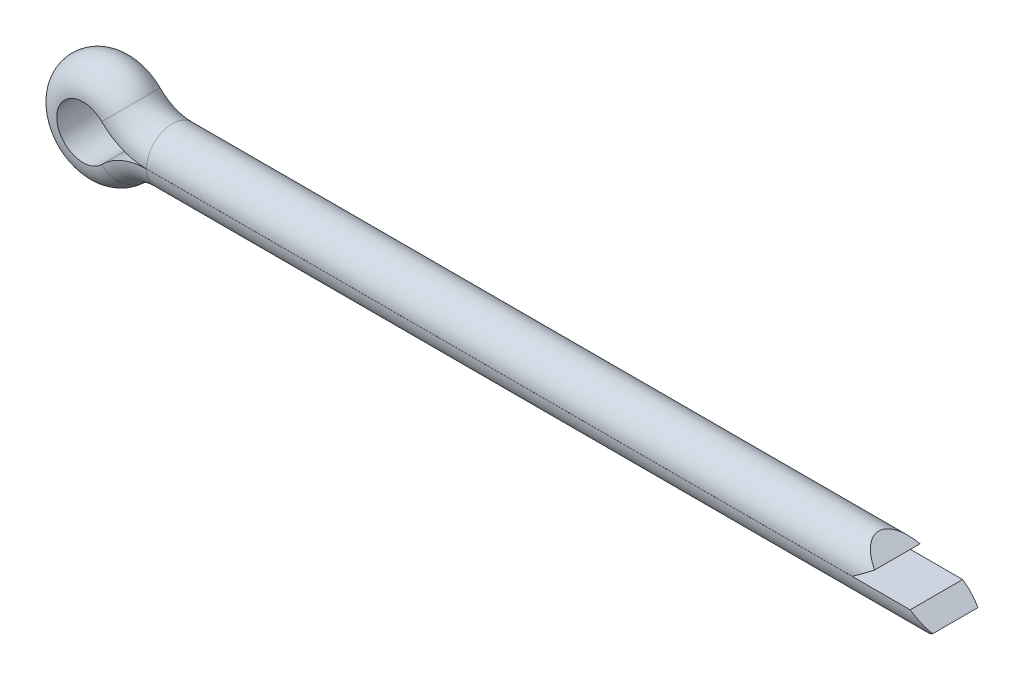
ISO-10303-21;
HEADER;
FILE_DESCRIPTION(('STEP AP214'),'2;1');
FILE_NAME('part.step','',(''),(''),'','','');
FILE_SCHEMA(('AUTOMOTIVE_DESIGN { 1 0 10303 214 1 1 1 1 }'));
ENDSEC;
DATA;
#1=APPLICATION_CONTEXT('core data for automotive mechanical design processes');
#2=APPLICATION_PROTOCOL_DEFINITION('international standard','automotive_design',2000,#1);
#3=PRODUCT_CONTEXT('',#1,'mechanical');
#4=PRODUCT('Part','Part','',(#3));
#5=PRODUCT_RELATED_PRODUCT_CATEGORY('part','',(#4));
#6=PRODUCT_DEFINITION_FORMATION('','',#4);
#7=PRODUCT_DEFINITION_CONTEXT('part definition',#1,'design');
#8=PRODUCT_DEFINITION('design','',#6,#7);
#9=PRODUCT_DEFINITION_SHAPE('','',#8);
#10=(LENGTH_UNIT() NAMED_UNIT(*) SI_UNIT(.MILLI.,.METRE.));
#11=(NAMED_UNIT(*) PLANE_ANGLE_UNIT() SI_UNIT($,.RADIAN.));
#12=(NAMED_UNIT(*) SI_UNIT($,.STERADIAN.) SOLID_ANGLE_UNIT());
#13=UNCERTAINTY_MEASURE_WITH_UNIT(LENGTH_MEASURE(1.E-05),#10,'distance_accuracy_value','');
#14=(GEOMETRIC_REPRESENTATION_CONTEXT(3) GLOBAL_UNCERTAINTY_ASSIGNED_CONTEXT((#13)) GLOBAL_UNIT_ASSIGNED_CONTEXT((#10,
#11,#12)) REPRESENTATION_CONTEXT('',''));
#15=CARTESIAN_POINT('',(0.,0.,0.));
#16=DIRECTION('',(0.,0.,1.));
#17=DIRECTION('',(1.,0.,0.));
#18=AXIS2_PLACEMENT_3D('',#15,#16,#17);
#19=CARTESIAN_POINT('',(0.,-0.00200000000000027,1.449998620689));
#20=DIRECTION('',(0.,-1.,0.));
#21=DIRECTION('',(0.,0.,-1.));
#22=AXIS2_PLACEMENT_3D('',#19,#20,#21);
#23=PLANE('',#22);
#24=DIRECTION('',(1.,0.,0.));
#25=VECTOR('',#24,1.);
#26=CARTESIAN_POINT('',(0.,-0.00200000000000027,1.449998620689));
#27=LINE('',#26,#25);
#28=CARTESIAN_POINT('',(0.,-0.00200000000000027,1.449998620689));
#29=VERTEX_POINT('',#28);
#30=CARTESIAN_POINT('',(42.1575308738926,-0.00199999999999788,1.449998620689));
#31=VERTEX_POINT('',#30);
#32=EDGE_CURVE('E40',#29,#31,#27,.T.);
#33=ORIENTED_EDGE('',*,*,#32,.T.);
#34=DIRECTION('',(0.,0.,-1.));
#35=VECTOR('',#34,1.);
#36=CARTESIAN_POINT('',(42.1575308738926,-0.00200000000000027,1.449998620689));
#37=LINE('',#36,#35);
#38=CARTESIAN_POINT('',(42.1575308738926,-0.00199999999999788,-1.449998620689));
#39=VERTEX_POINT('',#38);
#40=EDGE_CURVE('E96',#31,#39,#37,.T.);
#41=ORIENTED_EDGE('',*,*,#40,.T.);
#42=DIRECTION('',(1.,0.,0.));
#43=VECTOR('',#42,1.);
#44=CARTESIAN_POINT('',(0.,-0.00200000000000027,-1.449998620689));
#45=LINE('',#44,#43);
#46=CARTESIAN_POINT('',(0.,-0.00200000000000027,-1.449998620689));
#47=VERTEX_POINT('',#46);
#48=EDGE_CURVE('E11',#47,#39,#45,.T.);
#49=ORIENTED_EDGE('',*,*,#48,.F.);
#50=DIRECTION('',(0.,0.,-1.));
#51=VECTOR('',#50,1.);
#52=CARTESIAN_POINT('',(0.,-0.00200000000000027,1.449998620689));
#53=LINE('',#52,#51);
#54=EDGE_CURVE('E113',#29,#47,#53,.T.);
#55=ORIENTED_EDGE('',*,*,#54,.F.);
#56=EDGE_LOOP('',(#33,#41,#49,#55));
#57=FACE_BOUND('',#56,.T.);
#58=ADVANCED_FACE('F33',(#57),#23,.F.);
#59=CARTESIAN_POINT('',(0.,0.,0.));
#60=DIRECTION('',(1.,0.,0.));
#61=DIRECTION('',(0.,0.,-1.));
#62=AXIS2_PLACEMENT_3D('',#59,#60,#61);
#63=CYLINDRICAL_SURFACE('',#62,1.45);
#64=CARTESIAN_POINT('',(44.2284148200576,0.,0.));
#65=DIRECTION('',(-0.57671507613082,0.816945359839581,0.));
#66=DIRECTION('',(0.816945359839581,0.57671507613082,0.));
#67=AXIS2_PLACEMENT_3D('',#64,#65,#66);
#68=ELLIPSE('',#67,2.51423980404335,1.45);
#69=CARTESIAN_POINT('',(43.2,-0.725999999999993,-1.25515895407714));
#70=VERTEX_POINT('',#69);
#71=CARTESIAN_POINT('',(43.2,-0.726,1.25515895407714));
#72=VERTEX_POINT('',#71);
#73=EDGE_CURVE('E110',#70,#72,#68,.T.);
#74=ORIENTED_EDGE('',*,*,#73,.T.);
#75=CARTESIAN_POINT('',(42.1546511249255,0.,0.));
#76=DIRECTION('',(-0.570429353230208,-0.821346670397687,0.));
#77=DIRECTION('',(0.821346670397687,-0.570429353230208,0.));
#78=AXIS2_PLACEMENT_3D('',#75,#76,#77);
#79=ELLIPSE('',#78,2.54194492585101,1.45);
#80=EDGE_CURVE('E99',#72,#31,#79,.T.);
#81=ORIENTED_EDGE('',*,*,#80,.T.);
#82=ORIENTED_EDGE('',*,*,#32,.F.);
#83=CARTESIAN_POINT('',(0.,0.,0.));
#84=DIRECTION('',(-1.,0.,0.));
#85=DIRECTION('',(0.,0.,-1.));
#86=AXIS2_PLACEMENT_3D('',#83,#84,#85);
#87=CIRCLE('',#86,1.45);
#88=EDGE_CURVE('E123',#47,#29,#87,.T.);
#89=ORIENTED_EDGE('',*,*,#88,.F.);
#90=ORIENTED_EDGE('',*,*,#48,.T.);
#91=EDGE_CURVE('E101',#39,#70,#79,.T.);
#92=ORIENTED_EDGE('',*,*,#91,.T.);
#93=EDGE_LOOP('',(#74,#81,#82,#89,#90,#92));
#94=FACE_BOUND('',#93,.T.);
#95=ADVANCED_FACE('F107',(#94),#63,.T.);
#96=CARTESIAN_POINT('',(0.,-3.49913793103449,0.));
#97=DIRECTION('',(0.,0.,-1.));
#98=DIRECTION('',(-1.,0.,0.));
#99=AXIS2_PLACEMENT_3D('',#96,#97,#98);
#100=CYLINDRICAL_SURFACE('',#99,3.49713793103448);
#101=DIRECTION('',(0.,0.,-1.));
#102=VECTOR('',#101,1.);
#103=CARTESIAN_POINT('',(-2.47315450269987,-1.02659257968994,1.449998620689));
#104=LINE('',#103,#102);
#105=CARTESIAN_POINT('',(-2.47315450269987,-1.02659257968994,1.449998620689));
#106=VERTEX_POINT('',#105);
#107=CARTESIAN_POINT('',(-2.47315450269987,-1.02659257968994,-1.449998620689));
#108=VERTEX_POINT('',#107);
#109=EDGE_CURVE('E131',#106,#108,#104,.T.);
#110=ORIENTED_EDGE('',*,*,#109,.F.);
#111=CARTESIAN_POINT('',(0.,-3.49913793103449,1.449998620689));
#112=DIRECTION('',(0.,0.,-1.));
#113=DIRECTION('',(-1.,0.,0.));
#114=AXIS2_PLACEMENT_3D('',#111,#112,#113);
#115=CIRCLE('',#114,3.49713793103448);
#116=EDGE_CURVE('E117',#106,#29,#115,.T.);
#117=ORIENTED_EDGE('',*,*,#116,.T.);
#118=ORIENTED_EDGE('',*,*,#54,.T.);
#119=CARTESIAN_POINT('',(0.,-3.49913793103449,-1.449998620689));
#120=DIRECTION('',(0.,0.,-1.));
#121=DIRECTION('',(-1.,0.,0.));
#122=AXIS2_PLACEMENT_3D('',#119,#120,#121);
#123=CIRCLE('',#122,3.49713793103448);
#124=EDGE_CURVE('E115',#108,#47,#123,.T.);
#125=ORIENTED_EDGE('',*,*,#124,.F.);
#126=EDGE_LOOP('',(#110,#117,#118,#125));
#127=FACE_BOUND('',#126,.T.);
#128=ADVANCED_FACE('F196',(#127),#100,.T.);
#129=CARTESIAN_POINT('',(0.,-3.49913793103449,0.));
#130=DIRECTION('',(0.,0.,-1.));
#131=DIRECTION('',(-1.,0.,0.));
#132=AXIS2_PLACEMENT_3D('',#129,#130,#131);
#133=TOROIDAL_SURFACE('',#132,3.49913793103448,1.45);
#134=CARTESIAN_POINT('',(-2.47456889043719,-1.02517854032397,0.));
#135=DIRECTION('',(-0.707019682982049,-0.707193868664006,0.));
#136=DIRECTION('',(0.,0.,-1.));
#137=AXIS2_PLACEMENT_3D('',#134,#135,#136);
#138=CIRCLE('',#137,1.45);
#139=EDGE_CURVE('E134',#108,#106,#138,.T.);
#140=ORIENTED_EDGE('',*,*,#139,.F.);
#141=ORIENTED_EDGE('',*,*,#124,.T.);
#142=ORIENTED_EDGE('',*,*,#88,.T.);
#143=ORIENTED_EDGE('',*,*,#116,.F.);
#144=EDGE_LOOP('',(#140,#141,#142,#143));
#145=FACE_BOUND('',#144,.T.);
#146=ADVANCED_FACE('F198',(#145),#133,.T.);
#147=CARTESIAN_POINT('',(-3.5,0.,0.));
#148=DIRECTION('',(0.,0.,1.));
#149=DIRECTION('',(1.,0.,0.));
#150=AXIS2_PLACEMENT_3D('',#147,#148,#149);
#151=CYLINDRICAL_SURFACE('',#150,1.452);
#152=DIRECTION('',(0.,0.,-1.));
#153=VECTOR('',#152,1.);
#154=CARTESIAN_POINT('',(-2.47315450269988,1.02659257968995,1.449998620689));
#155=LINE('',#154,#153);
#156=CARTESIAN_POINT('',(-2.47315450269988,1.02659257968995,1.449998620689));
#157=VERTEX_POINT('',#156);
#158=CARTESIAN_POINT('',(-2.47315450269988,1.02659257968995,-1.449998620689));
#159=VERTEX_POINT('',#158);
#160=EDGE_CURVE('E143',#157,#159,#155,.T.);
#161=ORIENTED_EDGE('',*,*,#160,.F.);
#162=CARTESIAN_POINT('',(-3.5,0.,1.449998620689));
#163=DIRECTION('',(0.,0.,1.));
#164=DIRECTION('',(1.,0.,0.));
#165=AXIS2_PLACEMENT_3D('',#162,#163,#164);
#166=CIRCLE('',#165,1.452);
#167=EDGE_CURVE('E128',#157,#106,#166,.T.);
#168=ORIENTED_EDGE('',*,*,#167,.T.);
#169=ORIENTED_EDGE('',*,*,#109,.T.);
#170=CARTESIAN_POINT('',(-3.5,0.,-1.449998620689));
#171=DIRECTION('',(0.,0.,1.));
#172=DIRECTION('',(1.,0.,0.));
#173=AXIS2_PLACEMENT_3D('',#170,#171,#172);
#174=CIRCLE('',#173,1.452);
#175=EDGE_CURVE('E125',#159,#108,#174,.T.);
#176=ORIENTED_EDGE('',*,*,#175,.F.);
#177=EDGE_LOOP('',(#161,#168,#169,#176));
#178=FACE_BOUND('',#177,.T.);
#179=ADVANCED_FACE('F193',(#178),#151,.F.);
#180=CARTESIAN_POINT('',(-3.5,0.,0.));
#181=DIRECTION('',(0.,0.,1.));
#182=DIRECTION('',(1.,0.,0.));
#183=AXIS2_PLACEMENT_3D('',#180,#181,#182);
#184=DEGENERATE_TOROIDAL_SURFACE('',#183,1.45,1.45,.T.);
#185=CARTESIAN_POINT('',(-2.47456889043721,1.02517854032398,0.));
#186=DIRECTION('',(0.707019682982059,-0.707193868663995,0.));
#187=DIRECTION('',(0.,0.,-1.));
#188=AXIS2_PLACEMENT_3D('',#185,#186,#187);
#189=CIRCLE('',#188,1.45);
#190=EDGE_CURVE('E146',#159,#157,#189,.T.);
#191=ORIENTED_EDGE('',*,*,#190,.F.);
#192=ORIENTED_EDGE('',*,*,#175,.T.);
#193=ORIENTED_EDGE('',*,*,#139,.T.);
#194=ORIENTED_EDGE('',*,*,#167,.F.);
#195=EDGE_LOOP('',(#191,#192,#193,#194));
#196=FACE_BOUND('',#195,.T.);
#197=ADVANCED_FACE('F190',(#196),#184,.T.);
#198=CARTESIAN_POINT('',(0.,3.49913793103448,0.));
#199=DIRECTION('',(0.,0.,-1.));
#200=DIRECTION('',(-1.,0.,0.));
#201=AXIS2_PLACEMENT_3D('',#198,#199,#200);
#202=CYLINDRICAL_SURFACE('',#201,3.49713793103448);
#203=DIRECTION('',(0.,0.,-1.));
#204=VECTOR('',#203,1.);
#205=CARTESIAN_POINT('',(0.,0.002,1.449998620689));
#206=LINE('',#205,#204);
#207=CARTESIAN_POINT('',(0.,0.002,1.449998620689));
#208=VERTEX_POINT('',#207);
#209=CARTESIAN_POINT('',(0.,0.002,-1.449998620689));
#210=VERTEX_POINT('',#209);
#211=EDGE_CURVE('E153',#208,#210,#206,.T.);
#212=ORIENTED_EDGE('',*,*,#211,.F.);
#213=CARTESIAN_POINT('',(0.,3.49913793103448,1.449998620689));
#214=DIRECTION('',(0.,0.,-1.));
#215=DIRECTION('',(-1.,0.,0.));
#216=AXIS2_PLACEMENT_3D('',#213,#214,#215);
#217=CIRCLE('',#216,3.49713793103448);
#218=EDGE_CURVE('E140',#208,#157,#217,.T.);
#219=ORIENTED_EDGE('',*,*,#218,.T.);
#220=ORIENTED_EDGE('',*,*,#160,.T.);
#221=CARTESIAN_POINT('',(0.,3.49913793103448,-1.449998620689));
#222=DIRECTION('',(0.,0.,-1.));
#223=DIRECTION('',(-1.,0.,0.));
#224=AXIS2_PLACEMENT_3D('',#221,#222,#223);
#225=CIRCLE('',#224,3.49713793103448);
#226=EDGE_CURVE('E137',#210,#159,#225,.T.);
#227=ORIENTED_EDGE('',*,*,#226,.F.);
#228=EDGE_LOOP('',(#212,#219,#220,#227));
#229=FACE_BOUND('',#228,.T.);
#230=ADVANCED_FACE('F184',(#229),#202,.T.);
#231=CARTESIAN_POINT('',(0.,3.49913793103448,0.));
#232=DIRECTION('',(0.,0.,-1.));
#233=DIRECTION('',(-1.,0.,0.));
#234=AXIS2_PLACEMENT_3D('',#231,#232,#233);
#235=TOROIDAL_SURFACE('',#234,3.49913793103448,1.45);
#236=CARTESIAN_POINT('',(0.,0.,0.));
#237=DIRECTION('',(1.,0.,0.));
#238=DIRECTION('',(0.,0.,-1.));
#239=AXIS2_PLACEMENT_3D('',#236,#237,#238);
#240=CIRCLE('',#239,1.45);
#241=EDGE_CURVE('E158',#210,#208,#240,.T.);
#242=ORIENTED_EDGE('',*,*,#241,.F.);
#243=ORIENTED_EDGE('',*,*,#226,.T.);
#244=ORIENTED_EDGE('',*,*,#190,.T.);
#245=ORIENTED_EDGE('',*,*,#218,.F.);
#246=EDGE_LOOP('',(#242,#243,#244,#245));
#247=FACE_BOUND('',#246,.T.);
#248=ADVANCED_FACE('F187',(#247),#235,.T.);
#249=CARTESIAN_POINT('',(0.,0.,0.));
#250=DIRECTION('',(1.,0.,0.));
#251=DIRECTION('',(0.,0.,-1.));
#252=AXIS2_PLACEMENT_3D('',#249,#250,#251);
#253=CYLINDRICAL_SURFACE('',#252,1.45);
#254=CARTESIAN_POINT('',(38.9546511249254,0.,0.));
#255=DIRECTION('',(-0.570429353230211,0.821346670397685,0.));
#256=DIRECTION('',(0.821346670397685,0.570429353230211,0.));
#257=AXIS2_PLACEMENT_3D('',#254,#255,#256);
#258=ELLIPSE('',#257,2.541944925851,1.45);
#259=CARTESIAN_POINT('',(40.,0.726,1.25515895407713));
#260=VERTEX_POINT('',#259);
#261=CARTESIAN_POINT('',(38.9575308738926,0.002,1.449998620689));
#262=VERTEX_POINT('',#261);
#263=EDGE_CURVE('E47',#260,#262,#258,.F.);
#264=ORIENTED_EDGE('',*,*,#263,.F.);
#265=CARTESIAN_POINT('',(41.0284148200575,0.,0.));
#266=DIRECTION('',(-0.57671507613082,-0.816945359839581,0.));
#267=DIRECTION('',(0.816945359839581,-0.57671507613082,0.));
#268=AXIS2_PLACEMENT_3D('',#265,#266,#267);
#269=ELLIPSE('',#268,2.51423980404335,1.45);
#270=CARTESIAN_POINT('',(40.,0.726,-1.25515895407713));
#271=VERTEX_POINT('',#270);
#272=EDGE_CURVE('E166',#271,#260,#269,.F.);
#273=ORIENTED_EDGE('',*,*,#272,.F.);
#274=CARTESIAN_POINT('',(38.9575308738926,0.00199999999999823,-1.449998620689));
#275=VERTEX_POINT('',#274);
#276=EDGE_CURVE('E162',#275,#271,#258,.F.);
#277=ORIENTED_EDGE('',*,*,#276,.F.);
#278=DIRECTION('',(1.,0.,0.));
#279=VECTOR('',#278,1.);
#280=CARTESIAN_POINT('',(0.,0.002,-1.449998620689));
#281=LINE('',#280,#279);
#282=EDGE_CURVE('E149',#210,#275,#281,.T.);
#283=ORIENTED_EDGE('',*,*,#282,.F.);
#284=ORIENTED_EDGE('',*,*,#241,.T.);
#285=DIRECTION('',(1.,0.,0.));
#286=VECTOR('',#285,1.);
#287=CARTESIAN_POINT('',(0.,0.002,1.449998620689));
#288=LINE('',#287,#286);
#289=EDGE_CURVE('E150',#208,#262,#288,.T.);
#290=ORIENTED_EDGE('',*,*,#289,.T.);
#291=EDGE_LOOP('',(#264,#273,#277,#283,#284,#290));
#292=FACE_BOUND('',#291,.T.);
#293=ADVANCED_FACE('F176',(#292),#253,.T.);
#294=CARTESIAN_POINT('',(0.,0.002,1.449998620689));
#295=DIRECTION('',(0.,-1.,0.));
#296=DIRECTION('',(0.,0.,-1.));
#297=AXIS2_PLACEMENT_3D('',#294,#295,#296);
#298=PLANE('',#297);
#299=DIRECTION('',(0.,0.,-1.));
#300=VECTOR('',#299,1.);
#301=CARTESIAN_POINT('',(38.9575308738926,0.002,1.449998620689));
#302=LINE('',#301,#300);
#303=EDGE_CURVE('E164',#262,#275,#302,.T.);
#304=ORIENTED_EDGE('',*,*,#303,.F.);
#305=ORIENTED_EDGE('',*,*,#289,.F.);
#306=ORIENTED_EDGE('',*,*,#211,.T.);
#307=ORIENTED_EDGE('',*,*,#282,.T.);
#308=EDGE_LOOP('',(#304,#305,#306,#307));
#309=FACE_BOUND('',#308,.T.);
#310=ADVANCED_FACE('F181',(#309),#298,.T.);
#311=CARTESIAN_POINT('',(40.,0.726,-1.449998620689));
#312=DIRECTION('',(-0.570429353230211,0.821346670397685,0.));
#313=DIRECTION('',(-0.821346670397685,-0.570429353230211,0.));
#314=AXIS2_PLACEMENT_3D('',#311,#312,#313);
#315=PLANE('',#314);
#316=ORIENTED_EDGE('',*,*,#263,.T.);
#317=ORIENTED_EDGE('',*,*,#303,.T.);
#318=ORIENTED_EDGE('',*,*,#276,.T.);
#319=DIRECTION('',(0.,0.,1.));
#320=VECTOR('',#319,1.);
#321=CARTESIAN_POINT('',(40.,0.726,-1.449998620689));
#322=LINE('',#321,#320);
#323=EDGE_CURVE('E168',#271,#260,#322,.T.);
#324=ORIENTED_EDGE('',*,*,#323,.T.);
#325=EDGE_LOOP('',(#316,#317,#318,#324));
#326=FACE_BOUND('',#325,.T.);
#327=ADVANCED_FACE('F171',(#326),#315,.F.);
#328=CARTESIAN_POINT('',(40.,0.726,-1.449998620689));
#329=DIRECTION('',(-0.57671507613082,-0.816945359839581,0.));
#330=DIRECTION('',(0.816945359839581,-0.57671507613082,0.));
#331=AXIS2_PLACEMENT_3D('',#328,#329,#330);
#332=PLANE('',#331);
#333=ORIENTED_EDGE('',*,*,#272,.T.);
#334=ORIENTED_EDGE('',*,*,#323,.F.);
#335=EDGE_LOOP('',(#333,#334));
#336=FACE_BOUND('',#335,.T.);
#337=ADVANCED_FACE('F277',(#336),#332,.F.);
#338=CARTESIAN_POINT('',(43.2,-0.726,-1.449998620689));
#339=DIRECTION('',(-0.57671507613082,0.816945359839581,0.));
#340=DIRECTION('',(-0.816945359839581,-0.57671507613082,0.));
#341=AXIS2_PLACEMENT_3D('',#338,#339,#340);
#342=PLANE('',#341);
#343=DIRECTION('',(0.,0.,1.));
#344=VECTOR('',#343,1.);
#345=CARTESIAN_POINT('',(43.2,-0.726,-1.449998620689));
#346=LINE('',#345,#344);
#347=EDGE_CURVE('E55',#70,#72,#346,.T.);
#348=ORIENTED_EDGE('',*,*,#347,.T.);
#349=ORIENTED_EDGE('',*,*,#73,.F.);
#350=EDGE_LOOP('',(#348,#349));
#351=FACE_BOUND('',#350,.T.);
#352=ADVANCED_FACE('F284',(#351),#342,.F.);
#353=CARTESIAN_POINT('',(43.2,-0.726,-1.449998620689));
#354=DIRECTION('',(-0.570429353230208,-0.821346670397687,0.));
#355=DIRECTION('',(0.821346670397687,-0.570429353230208,0.));
#356=AXIS2_PLACEMENT_3D('',#353,#354,#355);
#357=PLANE('',#356);
#358=ORIENTED_EDGE('',*,*,#347,.F.);
#359=ORIENTED_EDGE('',*,*,#91,.F.);
#360=ORIENTED_EDGE('',*,*,#40,.F.);
#361=ORIENTED_EDGE('',*,*,#80,.F.);
#362=EDGE_LOOP('',(#358,#359,#360,#361));
#363=FACE_BOUND('',#362,.T.);
#364=ADVANCED_FACE('F98',(#363),#357,.F.);
#365=CLOSED_SHELL('',(#58,#95,#128,#146,#179,#197,#230,#248,#293,#310,#327,#337,#352,#364));
#366=MANIFOLD_SOLID_BREP('B2',#365);
#367=ADVANCED_BREP_SHAPE_REPRESENTATION('',(#18,#366),#14);
#368=SHAPE_DEFINITION_REPRESENTATION(#9,#367);
ENDSEC;
END-ISO-10303-21;
